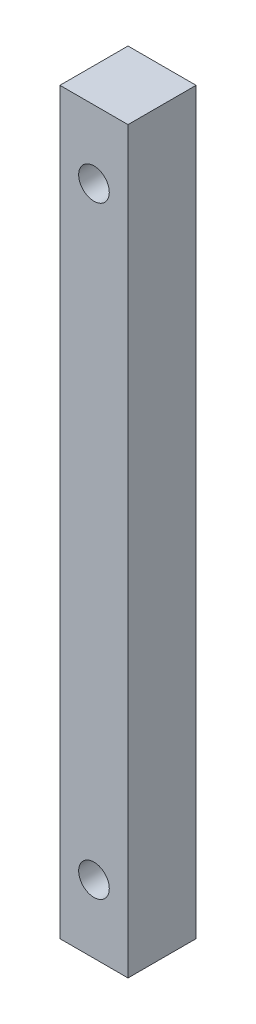
ISO-10303-21;
HEADER;
FILE_DESCRIPTION(('STEP AP214'),'2;1');
FILE_NAME('part.step','',(''),(''),'','','');
FILE_SCHEMA(('AUTOMOTIVE_DESIGN { 1 0 10303 214 1 1 1 1 }'));
ENDSEC;
DATA;
#1=APPLICATION_CONTEXT('core data for automotive mechanical design processes');
#2=APPLICATION_PROTOCOL_DEFINITION('international standard','automotive_design',2000,#1);
#3=PRODUCT_CONTEXT('',#1,'mechanical');
#4=PRODUCT('Part','Part','',(#3));
#5=PRODUCT_RELATED_PRODUCT_CATEGORY('part','',(#4));
#6=PRODUCT_DEFINITION_FORMATION('','',#4);
#7=PRODUCT_DEFINITION_CONTEXT('part definition',#1,'design');
#8=PRODUCT_DEFINITION('design','',#6,#7);
#9=PRODUCT_DEFINITION_SHAPE('','',#8);
#10=(LENGTH_UNIT() NAMED_UNIT(*) SI_UNIT(.MILLI.,.METRE.));
#11=(NAMED_UNIT(*) PLANE_ANGLE_UNIT() SI_UNIT($,.RADIAN.));
#12=(NAMED_UNIT(*) SI_UNIT($,.STERADIAN.) SOLID_ANGLE_UNIT());
#13=UNCERTAINTY_MEASURE_WITH_UNIT(LENGTH_MEASURE(1.E-05),#10,'distance_accuracy_value','');
#14=(GEOMETRIC_REPRESENTATION_CONTEXT(3) GLOBAL_UNCERTAINTY_ASSIGNED_CONTEXT((#13)) GLOBAL_UNIT_ASSIGNED_CONTEXT((#10,
#11,#12)) REPRESENTATION_CONTEXT('',''));
#15=CARTESIAN_POINT('',(0.,0.,0.));
#16=DIRECTION('',(0.,0.,1.));
#17=DIRECTION('',(1.,0.,0.));
#18=AXIS2_PLACEMENT_3D('',#15,#16,#17);
#19=CARTESIAN_POINT('',(0.,0.,5.08));
#20=DIRECTION('',(0.,0.,1.));
#21=DIRECTION('',(1.,0.,0.));
#22=AXIS2_PLACEMENT_3D('',#19,#20,#21);
#23=PLANE('',#22);
#24=CARTESIAN_POINT('',(-2.54000000000001,34.3648920863309,5.08));
#25=DIRECTION('',(0.,0.,1.));
#26=DIRECTION('',(1.,0.,0.));
#27=AXIS2_PLACEMENT_3D('',#24,#25,#26);
#28=CIRCLE('',#27,1.143);
#29=CARTESIAN_POINT('',(-1.39700000000001,34.3648920863309,5.08));
#30=VERTEX_POINT('',#29);
#31=EDGE_CURVE('E102',#30,#30,#28,.T.);
#32=ORIENTED_EDGE('',*,*,#31,.F.);
#33=EDGE_LOOP('',(#32));
#34=FACE_BOUND('',#33,.T.);
#35=DIRECTION('',(0.,-1.,0.));
#36=VECTOR('',#35,1.);
#37=CARTESIAN_POINT('',(-5.08000000000001,39.4448920863309,5.08));
#38=LINE('',#37,#36);
#39=CARTESIAN_POINT('',(-5.08000000000001,39.4448920863309,5.08));
#40=VERTEX_POINT('',#39);
#41=CARTESIAN_POINT('',(-5.08,-15.7151079136691,5.08));
#42=VERTEX_POINT('',#41);
#43=EDGE_CURVE('E87',#40,#42,#38,.T.);
#44=ORIENTED_EDGE('',*,*,#43,.T.);
#45=DIRECTION('',(1.,0.,0.));
#46=VECTOR('',#45,1.);
#47=CARTESIAN_POINT('',(-5.08,-15.7151079136691,5.08));
#48=LINE('',#47,#46);
#49=CARTESIAN_POINT('',(0.,-15.7151079136691,5.08));
#50=VERTEX_POINT('',#49);
#51=EDGE_CURVE('E82',#42,#50,#48,.T.);
#52=ORIENTED_EDGE('',*,*,#51,.T.);
#53=DIRECTION('',(0.,1.,0.));
#54=VECTOR('',#53,1.);
#55=CARTESIAN_POINT('',(0.,39.4448920863309,5.08));
#56=LINE('',#55,#54);
#57=CARTESIAN_POINT('',(0.,39.4448920863309,5.08));
#58=VERTEX_POINT('',#57);
#59=EDGE_CURVE('E85',#50,#58,#56,.T.);
#60=ORIENTED_EDGE('',*,*,#59,.T.);
#61=DIRECTION('',(-1.,0.,0.));
#62=VECTOR('',#61,1.);
#63=CARTESIAN_POINT('',(-5.08000000000001,39.4448920863309,5.08));
#64=LINE('',#63,#62);
#65=EDGE_CURVE('E52',#58,#40,#64,.T.);
#66=ORIENTED_EDGE('',*,*,#65,.T.);
#67=EDGE_LOOP('',(#44,#52,#60,#66));
#68=FACE_BOUND('',#67,.T.);
#69=CARTESIAN_POINT('',(-2.54,-10.6351079136691,5.08));
#70=DIRECTION('',(0.,0.,1.));
#71=DIRECTION('',(1.,0.,0.));
#72=AXIS2_PLACEMENT_3D('',#69,#70,#71);
#73=CIRCLE('',#72,1.143);
#74=CARTESIAN_POINT('',(-1.397,-10.6351079136691,5.08));
#75=VERTEX_POINT('',#74);
#76=EDGE_CURVE('E117',#75,#75,#73,.T.);
#77=ORIENTED_EDGE('',*,*,#76,.F.);
#78=EDGE_LOOP('',(#77));
#79=FACE_BOUND('',#78,.T.);
#80=ADVANCED_FACE('F35',(#34,#68,#79),#23,.T.);
#81=CARTESIAN_POINT('',(0.,0.,0.));
#82=DIRECTION('',(0.,0.,1.));
#83=DIRECTION('',(1.,0.,0.));
#84=AXIS2_PLACEMENT_3D('',#81,#82,#83);
#85=PLANE('',#84);
#86=DIRECTION('',(0.,-1.,0.));
#87=VECTOR('',#86,1.);
#88=CARTESIAN_POINT('',(-5.08000000000001,39.4448920863309,0.));
#89=LINE('',#88,#87);
#90=CARTESIAN_POINT('',(-5.08000000000001,39.4448920863309,0.));
#91=VERTEX_POINT('',#90);
#92=CARTESIAN_POINT('',(-5.08,-15.7151079136691,0.));
#93=VERTEX_POINT('',#92);
#94=EDGE_CURVE('E99',#91,#93,#89,.T.);
#95=ORIENTED_EDGE('',*,*,#94,.F.);
#96=DIRECTION('',(-1.,0.,0.));
#97=VECTOR('',#96,1.);
#98=CARTESIAN_POINT('',(-5.08000000000001,39.4448920863309,0.));
#99=LINE('',#98,#97);
#100=CARTESIAN_POINT('',(0.,39.4448920863309,0.));
#101=VERTEX_POINT('',#100);
#102=EDGE_CURVE('E75',#101,#91,#99,.T.);
#103=ORIENTED_EDGE('',*,*,#102,.F.);
#104=DIRECTION('',(0.,1.,0.));
#105=VECTOR('',#104,1.);
#106=CARTESIAN_POINT('',(0.,39.4448920863309,0.));
#107=LINE('',#106,#105);
#108=CARTESIAN_POINT('',(0.,-15.7151079136691,0.));
#109=VERTEX_POINT('',#108);
#110=EDGE_CURVE('E69',#109,#101,#107,.T.);
#111=ORIENTED_EDGE('',*,*,#110,.F.);
#112=DIRECTION('',(1.,0.,0.));
#113=VECTOR('',#112,1.);
#114=CARTESIAN_POINT('',(-5.08,-15.7151079136691,0.));
#115=LINE('',#114,#113);
#116=EDGE_CURVE('E91',#93,#109,#115,.T.);
#117=ORIENTED_EDGE('',*,*,#116,.F.);
#118=EDGE_LOOP('',(#95,#103,#111,#117));
#119=FACE_BOUND('',#118,.T.);
#120=CARTESIAN_POINT('',(-2.54000000000001,34.3648920863309,0.));
#121=DIRECTION('',(0.,0.,1.));
#122=DIRECTION('',(1.,0.,0.));
#123=AXIS2_PLACEMENT_3D('',#120,#121,#122);
#124=CIRCLE('',#123,1.143);
#125=CARTESIAN_POINT('',(-1.39700000000001,34.3648920863309,0.));
#126=VERTEX_POINT('',#125);
#127=EDGE_CURVE('E114',#126,#126,#124,.T.);
#128=ORIENTED_EDGE('',*,*,#127,.T.);
#129=EDGE_LOOP('',(#128));
#130=FACE_BOUND('',#129,.T.);
#131=CARTESIAN_POINT('',(-2.54,-10.6351079136691,0.));
#132=DIRECTION('',(0.,0.,1.));
#133=DIRECTION('',(1.,0.,0.));
#134=AXIS2_PLACEMENT_3D('',#131,#132,#133);
#135=CIRCLE('',#134,1.143);
#136=CARTESIAN_POINT('',(-1.397,-10.6351079136691,0.));
#137=VERTEX_POINT('',#136);
#138=EDGE_CURVE('E120',#137,#137,#135,.T.);
#139=ORIENTED_EDGE('',*,*,#138,.T.);
#140=EDGE_LOOP('',(#139));
#141=FACE_BOUND('',#140,.T.);
#142=ADVANCED_FACE('F110',(#119,#130,#141),#85,.F.);
#143=CARTESIAN_POINT('',(-5.08000000000001,39.4448920863309,5.08));
#144=DIRECTION('',(1.,0.,0.));
#145=DIRECTION('',(0.,1.,0.));
#146=AXIS2_PLACEMENT_3D('',#143,#144,#145);
#147=PLANE('',#146);
#148=ORIENTED_EDGE('',*,*,#94,.T.);
#149=DIRECTION('',(0.,0.,-1.));
#150=VECTOR('',#149,1.);
#151=CARTESIAN_POINT('',(-5.08,-15.7151079136691,5.08));
#152=LINE('',#151,#150);
#153=EDGE_CURVE('E11',#42,#93,#152,.T.);
#154=ORIENTED_EDGE('',*,*,#153,.F.);
#155=ORIENTED_EDGE('',*,*,#43,.F.);
#156=DIRECTION('',(0.,0.,-1.));
#157=VECTOR('',#156,1.);
#158=CARTESIAN_POINT('',(-5.08000000000001,39.4448920863309,5.08));
#159=LINE('',#158,#157);
#160=EDGE_CURVE('E95',#40,#91,#159,.T.);
#161=ORIENTED_EDGE('',*,*,#160,.T.);
#162=EDGE_LOOP('',(#148,#154,#155,#161));
#163=FACE_BOUND('',#162,.T.);
#164=ADVANCED_FACE('F37',(#163),#147,.F.);
#165=CARTESIAN_POINT('',(-5.08,-15.7151079136691,5.08));
#166=DIRECTION('',(0.,1.,0.));
#167=DIRECTION('',(0.,0.,1.));
#168=AXIS2_PLACEMENT_3D('',#165,#166,#167);
#169=PLANE('',#168);
#170=ORIENTED_EDGE('',*,*,#116,.T.);
#171=DIRECTION('',(0.,0.,-1.));
#172=VECTOR('',#171,1.);
#173=CARTESIAN_POINT('',(0.,-15.7151079136691,5.08));
#174=LINE('',#173,#172);
#175=EDGE_CURVE('E44',#50,#109,#174,.T.);
#176=ORIENTED_EDGE('',*,*,#175,.F.);
#177=ORIENTED_EDGE('',*,*,#51,.F.);
#178=ORIENTED_EDGE('',*,*,#153,.T.);
#179=EDGE_LOOP('',(#170,#176,#177,#178));
#180=FACE_BOUND('',#179,.T.);
#181=ADVANCED_FACE('F90',(#180),#169,.F.);
#182=CARTESIAN_POINT('',(0.,39.4448920863309,5.08));
#183=DIRECTION('',(-1.,0.,0.));
#184=DIRECTION('',(0.,-1.,0.));
#185=AXIS2_PLACEMENT_3D('',#182,#183,#184);
#186=PLANE('',#185);
#187=ORIENTED_EDGE('',*,*,#110,.T.);
#188=DIRECTION('',(0.,0.,-1.));
#189=VECTOR('',#188,1.);
#190=CARTESIAN_POINT('',(0.,39.4448920863309,5.08));
#191=LINE('',#190,#189);
#192=EDGE_CURVE('E92',#58,#101,#191,.T.);
#193=ORIENTED_EDGE('',*,*,#192,.F.);
#194=ORIENTED_EDGE('',*,*,#59,.F.);
#195=ORIENTED_EDGE('',*,*,#175,.T.);
#196=EDGE_LOOP('',(#187,#193,#194,#195));
#197=FACE_BOUND('',#196,.T.);
#198=ADVANCED_FACE('F93',(#197),#186,.F.);
#199=CARTESIAN_POINT('',(-5.08000000000001,39.4448920863309,5.08));
#200=DIRECTION('',(0.,-1.,0.));
#201=DIRECTION('',(0.,0.,-1.));
#202=AXIS2_PLACEMENT_3D('',#199,#200,#201);
#203=PLANE('',#202);
#204=ORIENTED_EDGE('',*,*,#102,.T.);
#205=ORIENTED_EDGE('',*,*,#160,.F.);
#206=ORIENTED_EDGE('',*,*,#65,.F.);
#207=ORIENTED_EDGE('',*,*,#192,.T.);
#208=EDGE_LOOP('',(#204,#205,#206,#207));
#209=FACE_BOUND('',#208,.T.);
#210=ADVANCED_FACE('F107',(#209),#203,.F.);
#211=CARTESIAN_POINT('',(-2.54000000000001,34.3648920863309,5.08));
#212=DIRECTION('',(0.,0.,-1.));
#213=DIRECTION('',(-1.,0.,0.));
#214=AXIS2_PLACEMENT_3D('',#211,#212,#213);
#215=CYLINDRICAL_SURFACE('',#214,1.143);
#216=ORIENTED_EDGE('',*,*,#31,.T.);
#217=EDGE_LOOP('',(#216));
#218=FACE_BOUND('',#217,.T.);
#219=ORIENTED_EDGE('',*,*,#127,.F.);
#220=EDGE_LOOP('',(#219));
#221=FACE_BOUND('',#220,.T.);
#222=ADVANCED_FACE('F137',(#218,#221),#215,.F.);
#223=CARTESIAN_POINT('',(-2.54,-10.6351079136691,5.08));
#224=DIRECTION('',(0.,0.,-1.));
#225=DIRECTION('',(-1.,0.,0.));
#226=AXIS2_PLACEMENT_3D('',#223,#224,#225);
#227=CYLINDRICAL_SURFACE('',#226,1.143);
#228=ORIENTED_EDGE('',*,*,#76,.T.);
#229=EDGE_LOOP('',(#228));
#230=FACE_BOUND('',#229,.T.);
#231=ORIENTED_EDGE('',*,*,#138,.F.);
#232=EDGE_LOOP('',(#231));
#233=FACE_BOUND('',#232,.T.);
#234=ADVANCED_FACE('F126',(#230,#233),#227,.F.);
#235=CLOSED_SHELL('',(#80,#142,#164,#181,#198,#210,#222,#234));
#236=MANIFOLD_SOLID_BREP('B2',#235);
#237=ADVANCED_BREP_SHAPE_REPRESENTATION('',(#18,#236),#14);
#238=SHAPE_DEFINITION_REPRESENTATION(#9,#237);
ENDSEC;
END-ISO-10303-21;
